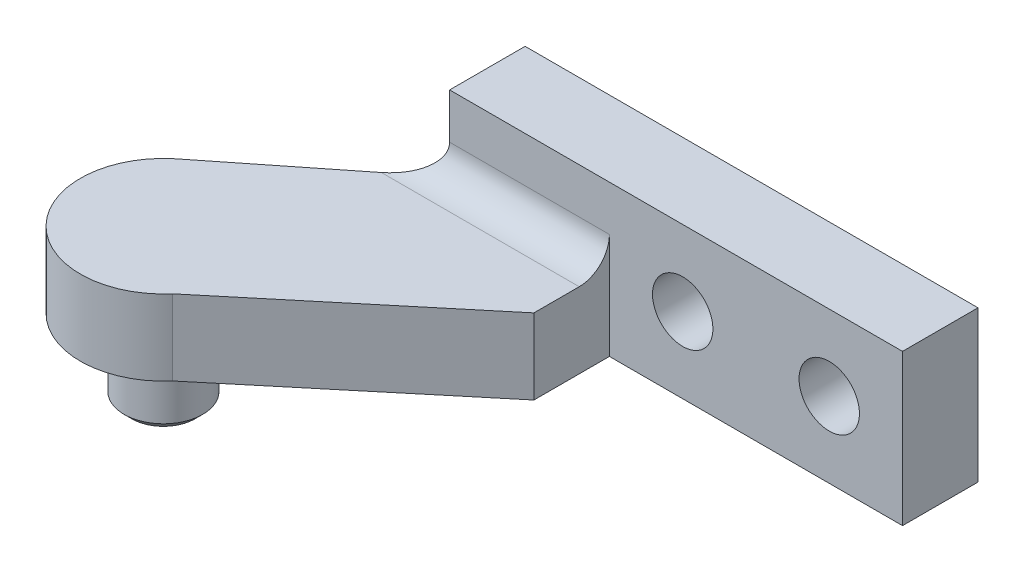
ISO-10303-21;
HEADER;
FILE_DESCRIPTION(('STEP AP214'),'2;1');
FILE_NAME('part.step','',(''),(''),'','','');
FILE_SCHEMA(('AUTOMOTIVE_DESIGN { 1 0 10303 214 1 1 1 1 }'));
ENDSEC;
DATA;
#1=APPLICATION_CONTEXT('core data for automotive mechanical design processes');
#2=APPLICATION_PROTOCOL_DEFINITION('international standard','automotive_design',2000,#1);
#3=PRODUCT_CONTEXT('',#1,'mechanical');
#4=PRODUCT('Part','Part','',(#3));
#5=PRODUCT_RELATED_PRODUCT_CATEGORY('part','',(#4));
#6=PRODUCT_DEFINITION_FORMATION('','',#4);
#7=PRODUCT_DEFINITION_CONTEXT('part definition',#1,'design');
#8=PRODUCT_DEFINITION('design','',#6,#7);
#9=PRODUCT_DEFINITION_SHAPE('','',#8);
#10=(LENGTH_UNIT() NAMED_UNIT(*) SI_UNIT(.MILLI.,.METRE.));
#11=(NAMED_UNIT(*) PLANE_ANGLE_UNIT() SI_UNIT($,.RADIAN.));
#12=(NAMED_UNIT(*) SI_UNIT($,.STERADIAN.) SOLID_ANGLE_UNIT());
#13=UNCERTAINTY_MEASURE_WITH_UNIT(LENGTH_MEASURE(1.E-05),#10,'distance_accuracy_value','');
#14=(GEOMETRIC_REPRESENTATION_CONTEXT(3) GLOBAL_UNCERTAINTY_ASSIGNED_CONTEXT((#13)) GLOBAL_UNIT_ASSIGNED_CONTEXT((#10,
#11,#12)) REPRESENTATION_CONTEXT('',''));
#15=CARTESIAN_POINT('',(0.,0.,0.));
#16=DIRECTION('',(0.,0.,1.));
#17=DIRECTION('',(1.,0.,0.));
#18=AXIS2_PLACEMENT_3D('',#15,#16,#17);
#19=CARTESIAN_POINT('',(21.8540407080777,5.,0.));
#20=DIRECTION('',(-1.,0.,0.));
#21=DIRECTION('',(0.,0.,-1.));
#22=AXIS2_PLACEMENT_3D('',#19,#20,#21);
#23=PLANE('',#22);
#24=DIRECTION('',(0.,-1.,0.));
#25=VECTOR('',#24,1.);
#26=CARTESIAN_POINT('',(21.8540407080777,10.,-19.9532567430728));
#27=LINE('',#26,#25);
#28=CARTESIAN_POINT('',(21.8540407080777,10.,-19.9532567430728));
#29=VERTEX_POINT('',#28);
#30=CARTESIAN_POINT('',(21.8540407080777,0.,-19.9532567430728));
#31=VERTEX_POINT('',#30);
#32=EDGE_CURVE('E116',#29,#31,#27,.T.);
#33=ORIENTED_EDGE('',*,*,#32,.T.);
#34=DIRECTION('',(0.,0.,1.));
#35=VECTOR('',#34,1.);
#36=CARTESIAN_POINT('',(21.8540407080777,0.,0.));
#37=LINE('',#36,#35);
#38=CARTESIAN_POINT('',(21.8540407080777,0.,-24.9532567430728));
#39=VERTEX_POINT('',#38);
#40=EDGE_CURVE('E123',#39,#31,#37,.T.);
#41=ORIENTED_EDGE('',*,*,#40,.F.);
#42=DIRECTION('',(0.,1.,0.));
#43=VECTOR('',#42,1.);
#44=CARTESIAN_POINT('',(21.8540407080777,0.,-24.9532567430728));
#45=LINE('',#44,#43);
#46=CARTESIAN_POINT('',(21.8540407080777,10.,-24.9532567430728));
#47=VERTEX_POINT('',#46);
#48=EDGE_CURVE('E165',#39,#47,#45,.T.);
#49=ORIENTED_EDGE('',*,*,#48,.T.);
#50=DIRECTION('',(0.,0.,1.));
#51=VECTOR('',#50,1.);
#52=CARTESIAN_POINT('',(21.8540407080777,10.,-14.9532567430728));
#53=LINE('',#52,#51);
#54=EDGE_CURVE('E136',#47,#29,#53,.T.);
#55=ORIENTED_EDGE('',*,*,#54,.T.);
#56=EDGE_LOOP('',(#33,#41,#49,#55));
#57=FACE_BOUND('',#56,.T.);
#58=ADVANCED_FACE('F43',(#57),#23,.F.);
#59=CARTESIAN_POINT('',(0.,10.,0.));
#60=DIRECTION('',(0.,-1.,0.));
#61=DIRECTION('',(0.,0.,1.));
#62=AXIS2_PLACEMENT_3D('',#59,#60,#61);
#63=PLANE('',#62);
#64=DIRECTION('',(1.,0.,0.));
#65=VECTOR('',#64,1.);
#66=CARTESIAN_POINT('',(-14.452391165853,10.,-19.9532567430728));
#67=LINE('',#66,#65);
#68=CARTESIAN_POINT('',(-8.14595929192235,10.,-19.9532567430728));
#69=VERTEX_POINT('',#68);
#70=EDGE_CURVE('E140',#69,#29,#67,.T.);
#71=ORIENTED_EDGE('',*,*,#70,.T.);
#72=ORIENTED_EDGE('',*,*,#54,.F.);
#73=DIRECTION('',(1.,0.,0.));
#74=VECTOR('',#73,1.);
#75=CARTESIAN_POINT('',(0.,10.,-24.9532567430728));
#76=LINE('',#75,#74);
#77=CARTESIAN_POINT('',(-8.14595929192235,10.,-24.9532567430728));
#78=VERTEX_POINT('',#77);
#79=EDGE_CURVE('E159',#78,#47,#76,.T.);
#80=ORIENTED_EDGE('',*,*,#79,.F.);
#81=DIRECTION('',(0.,0.,-1.));
#82=VECTOR('',#81,1.);
#83=CARTESIAN_POINT('',(-8.14595929192235,10.,0.));
#84=LINE('',#83,#82);
#85=EDGE_CURVE('E154',#69,#78,#84,.T.);
#86=ORIENTED_EDGE('',*,*,#85,.F.);
#87=EDGE_LOOP('',(#71,#72,#80,#86));
#88=FACE_BOUND('',#87,.T.);
#89=ADVANCED_FACE('F245',(#88),#63,.F.);
#90=CARTESIAN_POINT('',(16.9998841256251,5.,-24.9532567430728));
#91=DIRECTION('',(0.,0.,1.));
#92=DIRECTION('',(-1.,0.,0.));
#93=AXIS2_PLACEMENT_3D('',#90,#91,#92);
#94=CYLINDRICAL_SURFACE('',#93,2.);
#95=CARTESIAN_POINT('',(16.9998841256251,5.,-24.9532567430728));
#96=DIRECTION('',(0.,0.,1.));
#97=DIRECTION('',(1.,0.,0.));
#98=AXIS2_PLACEMENT_3D('',#95,#96,#97);
#99=CIRCLE('',#98,2.);
#100=CARTESIAN_POINT('',(18.9998841256251,5.,-24.9532567430728));
#101=VERTEX_POINT('',#100);
#102=EDGE_CURVE('E150',#101,#101,#99,.T.);
#103=ORIENTED_EDGE('',*,*,#102,.F.);
#104=EDGE_LOOP('',(#103));
#105=FACE_BOUND('',#104,.T.);
#106=CARTESIAN_POINT('',(16.9998841256251,5.,-19.9532567430728));
#107=DIRECTION('',(0.,0.,-1.));
#108=DIRECTION('',(-1.,0.,0.));
#109=AXIS2_PLACEMENT_3D('',#106,#107,#108);
#110=CIRCLE('',#109,2.);
#111=CARTESIAN_POINT('',(14.9998841256251,5.,-19.9532567430728));
#112=VERTEX_POINT('',#111);
#113=EDGE_CURVE('E147',#112,#112,#110,.T.);
#114=ORIENTED_EDGE('',*,*,#113,.F.);
#115=EDGE_LOOP('',(#114));
#116=FACE_BOUND('',#115,.T.);
#117=ADVANCED_FACE('F250',(#105,#116),#94,.F.);
#118=CARTESIAN_POINT('',(7.29157096072009,5.,-24.9532567430728));
#119=DIRECTION('',(0.,0.,1.));
#120=DIRECTION('',(-1.,0.,0.));
#121=AXIS2_PLACEMENT_3D('',#118,#119,#120);
#122=CYLINDRICAL_SURFACE('',#121,2.);
#123=CARTESIAN_POINT('',(7.29157096072009,5.,-24.9532567430728));
#124=DIRECTION('',(0.,0.,-1.));
#125=DIRECTION('',(-1.,0.,0.));
#126=AXIS2_PLACEMENT_3D('',#123,#124,#125);
#127=CIRCLE('',#126,2.);
#128=CARTESIAN_POINT('',(5.29157096072009,5.,-24.9532567430728));
#129=VERTEX_POINT('',#128);
#130=EDGE_CURVE('E151',#129,#129,#127,.T.);
#131=ORIENTED_EDGE('',*,*,#130,.T.);
#132=EDGE_LOOP('',(#131));
#133=FACE_BOUND('',#132,.T.);
#134=CARTESIAN_POINT('',(7.29157096072009,5.,-19.9532567430728));
#135=DIRECTION('',(0.,0.,-1.));
#136=DIRECTION('',(-1.,0.,0.));
#137=AXIS2_PLACEMENT_3D('',#134,#135,#136);
#138=CIRCLE('',#137,2.);
#139=CARTESIAN_POINT('',(5.29157096072009,5.,-19.9532567430728));
#140=VERTEX_POINT('',#139);
#141=EDGE_CURVE('E145',#140,#140,#138,.F.);
#142=ORIENTED_EDGE('',*,*,#141,.T.);
#143=EDGE_LOOP('',(#142));
#144=FACE_BOUND('',#143,.T.);
#145=ADVANCED_FACE('F275',(#133,#144),#122,.F.);
#146=CARTESIAN_POINT('',(0.,0.,-24.9532567430728));
#147=DIRECTION('',(0.,0.,-1.));
#148=DIRECTION('',(1.,0.,0.));
#149=AXIS2_PLACEMENT_3D('',#146,#147,#148);
#150=PLANE('',#149);
#151=ORIENTED_EDGE('',*,*,#102,.T.);
#152=EDGE_LOOP('',(#151));
#153=FACE_BOUND('',#152,.T.);
#154=ORIENTED_EDGE('',*,*,#79,.T.);
#155=ORIENTED_EDGE('',*,*,#48,.F.);
#156=DIRECTION('',(1.,0.,0.));
#157=VECTOR('',#156,1.);
#158=CARTESIAN_POINT('',(0.,0.,-24.9532567430728));
#159=LINE('',#158,#157);
#160=CARTESIAN_POINT('',(-8.14595929192235,0.,-24.9532567430728));
#161=VERTEX_POINT('',#160);
#162=EDGE_CURVE('E127',#161,#39,#159,.T.);
#163=ORIENTED_EDGE('',*,*,#162,.F.);
#164=DIRECTION('',(0.,1.,0.));
#165=VECTOR('',#164,1.);
#166=CARTESIAN_POINT('',(-8.14595929192235,0.,-24.9532567430728));
#167=LINE('',#166,#165);
#168=EDGE_CURVE('E161',#161,#78,#167,.T.);
#169=ORIENTED_EDGE('',*,*,#168,.T.);
#170=EDGE_LOOP('',(#154,#155,#163,#169));
#171=FACE_BOUND('',#170,.T.);
#172=ORIENTED_EDGE('',*,*,#130,.F.);
#173=EDGE_LOOP('',(#172));
#174=FACE_BOUND('',#173,.T.);
#175=ADVANCED_FACE('F242',(#153,#171,#174),#150,.T.);
#176=CARTESIAN_POINT('',(-6.35496567806132,5.,-7.63378536190709));
#177=DIRECTION('',(-0.639796801410756,0.,-0.768544112530026));
#178=DIRECTION('',(0.768544112530026,0.,-0.639796801410756));
#179=AXIS2_PLACEMENT_3D('',#176,#177,#178);
#180=PLANE('',#179);
#181=DIRECTION('',(-0.768544112530026,0.,0.639796801410756));
#182=VECTOR('',#181,1.);
#183=CARTESIAN_POINT('',(-6.35496567806132,0.,-7.63378536190709));
#184=LINE('',#183,#182);
#185=CARTESIAN_POINT('',(2.43741437826756,0.,-14.9532567430728));
#186=VERTEX_POINT('',#185);
#187=CARTESIAN_POINT('',(-10.632140567897,0.,-4.07312726957885));
#188=VERTEX_POINT('',#187);
#189=EDGE_CURVE('E169',#186,#188,#184,.T.);
#190=ORIENTED_EDGE('',*,*,#189,.F.);
#191=DIRECTION('',(0.,-1.,0.));
#192=VECTOR('',#191,1.);
#193=CARTESIAN_POINT('',(2.43741437826756,5.,-14.9532567430728));
#194=LINE('',#193,#192);
#195=CARTESIAN_POINT('',(2.43741437826756,5.,-14.9532567430728));
#196=VERTEX_POINT('',#195);
#197=EDGE_CURVE('E178',#196,#186,#194,.T.);
#198=ORIENTED_EDGE('',*,*,#197,.F.);
#199=DIRECTION('',(-0.768544112530026,0.,0.639796801410756));
#200=VECTOR('',#199,1.);
#201=CARTESIAN_POINT('',(-6.35496567806132,5.,-7.63378536190709));
#202=LINE('',#201,#200);
#203=CARTESIAN_POINT('',(-10.632140567897,5.,-4.07312726957885));
#204=VERTEX_POINT('',#203);
#205=EDGE_CURVE('E131',#196,#204,#202,.T.);
#206=ORIENTED_EDGE('',*,*,#205,.T.);
#207=DIRECTION('',(0.,-1.,0.));
#208=VECTOR('',#207,1.);
#209=CARTESIAN_POINT('',(-10.632140567897,5.,-4.07312726957885));
#210=LINE('',#209,#208);
#211=EDGE_CURVE('E194',#204,#188,#210,.T.);
#212=ORIENTED_EDGE('',*,*,#211,.T.);
#213=EDGE_LOOP('',(#190,#198,#206,#212));
#214=FACE_BOUND('',#213,.T.);
#215=ADVANCED_FACE('F232',(#214),#180,.F.);
#216=CARTESIAN_POINT('',(-14.807385824528,5.,-7.65325674307282));
#217=DIRECTION('',(0.,-1.,0.));
#218=DIRECTION('',(0.,0.,1.));
#219=AXIS2_PLACEMENT_3D('',#216,#217,#218);
#220=CYLINDRICAL_SURFACE('',#219,5.5);
#221=CARTESIAN_POINT('',(-14.807385824528,0.,-7.65325674307282));
#222=DIRECTION('',(0.,-1.,0.));
#223=DIRECTION('',(0.,0.,-1.));
#224=AXIS2_PLACEMENT_3D('',#221,#222,#223);
#225=CIRCLE('',#224,5.5);
#226=CARTESIAN_POINT('',(-18.2679945911423,0.,-11.9280885484697));
#227=VERTEX_POINT('',#226);
#228=EDGE_CURVE('E180',#188,#227,#225,.T.);
#229=ORIENTED_EDGE('',*,*,#228,.F.);
#230=ORIENTED_EDGE('',*,*,#211,.F.);
#231=CARTESIAN_POINT('',(-14.807385824528,5.,-7.65325674307282));
#232=DIRECTION('',(0.,-1.,0.));
#233=DIRECTION('',(0.,0.,-1.));
#234=AXIS2_PLACEMENT_3D('',#231,#232,#233);
#235=CIRCLE('',#234,5.5);
#236=CARTESIAN_POINT('',(-18.2679945911423,5.,-11.9280885484697));
#237=VERTEX_POINT('',#236);
#238=EDGE_CURVE('E172',#204,#237,#235,.T.);
#239=ORIENTED_EDGE('',*,*,#238,.T.);
#240=DIRECTION('',(0.,-1.,0.));
#241=VECTOR('',#240,1.);
#242=CARTESIAN_POINT('',(-18.2679945911423,5.,-11.9280885484697));
#243=LINE('',#242,#241);
#244=EDGE_CURVE('E191',#237,#227,#243,.T.);
#245=ORIENTED_EDGE('',*,*,#244,.T.);
#246=EDGE_LOOP('',(#229,#230,#239,#245));
#247=FACE_BOUND('',#246,.T.);
#248=ADVANCED_FACE('F234',(#247),#220,.T.);
#249=CARTESIAN_POINT('',(-12.8578713762529,5.,-16.2174579756204));
#250=DIRECTION('',(0.621268629874655,0.,0.783597657942945));
#251=DIRECTION('',(-0.783597657942945,0.,0.621268629874655));
#252=AXIS2_PLACEMENT_3D('',#249,#250,#251);
#253=PLANE('',#252);
#254=DIRECTION('',(0.,-1.,0.));
#255=VECTOR('',#254,1.);
#256=CARTESIAN_POINT('',(-8.14595929192235,5.,-19.9532567430728));
#257=LINE('',#256,#255);
#258=CARTESIAN_POINT('',(-8.14595929192235,7.,-19.9532567430728));
#259=VERTEX_POINT('',#258);
#260=CARTESIAN_POINT('',(-8.14595929192235,0.,-19.9532567430728));
#261=VERTEX_POINT('',#260);
#262=EDGE_CURVE('E187',#259,#261,#257,.T.);
#263=ORIENTED_EDGE('',*,*,#262,.T.);
#264=DIRECTION('',(0.783597657942946,0.,-0.621268629874655));
#265=VECTOR('',#264,1.);
#266=CARTESIAN_POINT('',(-12.8578713762529,0.,-16.2174579756204));
#267=LINE('',#266,#265);
#268=EDGE_CURVE('E132',#227,#261,#267,.T.);
#269=ORIENTED_EDGE('',*,*,#268,.F.);
#270=ORIENTED_EDGE('',*,*,#244,.F.);
#271=DIRECTION('',(0.783597657942946,0.,-0.621268629874655));
#272=VECTOR('',#271,1.);
#273=CARTESIAN_POINT('',(-12.8578713762529,5.,-16.2174579756204));
#274=LINE('',#273,#272);
#275=CARTESIAN_POINT('',(-10.6685320414946,5.,-17.9532567430728));
#276=VERTEX_POINT('',#275);
#277=EDGE_CURVE('E175',#237,#276,#274,.T.);
#278=ORIENTED_EDGE('',*,*,#277,.T.);
#279=CARTESIAN_POINT('',(-10.6685320414946,7.,-17.9532567430728));
#280=DIRECTION('',(-0.621268629874655,0.,-0.783597657942945));
#281=DIRECTION('',(0.783597657942945,0.,-0.621268629874655));
#282=AXIS2_PLACEMENT_3D('',#279,#280,#281);
#283=ELLIPSE('',#282,3.21921935830482,2.);
#284=EDGE_CURVE('E52',#259,#276,#283,.T.);
#285=ORIENTED_EDGE('',*,*,#284,.F.);
#286=EDGE_LOOP('',(#263,#269,#270,#278,#285));
#287=FACE_BOUND('',#286,.T.);
#288=ADVANCED_FACE('F223',(#287),#253,.F.);
#289=CARTESIAN_POINT('',(0.,5.,0.));
#290=DIRECTION('',(0.,1.,0.));
#291=DIRECTION('',(0.,0.,-1.));
#292=AXIS2_PLACEMENT_3D('',#289,#290,#291);
#293=PLANE('',#292);
#294=ORIENTED_EDGE('',*,*,#277,.F.);
#295=ORIENTED_EDGE('',*,*,#238,.F.);
#296=ORIENTED_EDGE('',*,*,#205,.F.);
#297=DIRECTION('',(0.,0.,1.));
#298=VECTOR('',#297,1.);
#299=CARTESIAN_POINT('',(2.43741437826756,5.,-19.9532567430728));
#300=LINE('',#299,#298);
#301=CARTESIAN_POINT('',(2.43741437826756,5.,-17.9532567430728));
#302=VERTEX_POINT('',#301);
#303=EDGE_CURVE('E143',#302,#196,#300,.T.);
#304=ORIENTED_EDGE('',*,*,#303,.F.);
#305=DIRECTION('',(-1.,0.,0.));
#306=VECTOR('',#305,1.);
#307=CARTESIAN_POINT('',(2.43741437826756,5.,-17.9532567430728));
#308=LINE('',#307,#306);
#309=EDGE_CURVE('E214',#276,#302,#308,.F.);
#310=ORIENTED_EDGE('',*,*,#309,.F.);
#311=EDGE_LOOP('',(#294,#295,#296,#304,#310));
#312=FACE_BOUND('',#311,.T.);
#313=ADVANCED_FACE('F225',(#312),#293,.T.);
#314=CARTESIAN_POINT('',(0.,0.,0.));
#315=DIRECTION('',(0.,1.,0.));
#316=DIRECTION('',(0.,0.,-1.));
#317=AXIS2_PLACEMENT_3D('',#314,#315,#316);
#318=PLANE('',#317);
#319=CARTESIAN_POINT('',(-14.807385824528,0.,-7.65325674307282));
#320=DIRECTION('',(0.,-1.,0.));
#321=DIRECTION('',(0.,0.,-1.));
#322=AXIS2_PLACEMENT_3D('',#319,#320,#321);
#323=CIRCLE('',#322,3.6);
#324=CARTESIAN_POINT('',(-14.807385824528,0.,-11.2532567430728));
#325=VERTEX_POINT('',#324);
#326=EDGE_CURVE('E203',#325,#325,#323,.T.);
#327=ORIENTED_EDGE('',*,*,#326,.F.);
#328=EDGE_LOOP('',(#327));
#329=FACE_BOUND('',#328,.T.);
#330=ORIENTED_EDGE('',*,*,#189,.T.);
#331=ORIENTED_EDGE('',*,*,#228,.T.);
#332=ORIENTED_EDGE('',*,*,#268,.T.);
#333=DIRECTION('',(0.,0.,-1.));
#334=VECTOR('',#333,1.);
#335=CARTESIAN_POINT('',(-8.14595929192235,0.,0.));
#336=LINE('',#335,#334);
#337=EDGE_CURVE('E157',#261,#161,#336,.T.);
#338=ORIENTED_EDGE('',*,*,#337,.T.);
#339=ORIENTED_EDGE('',*,*,#162,.T.);
#340=ORIENTED_EDGE('',*,*,#40,.T.);
#341=DIRECTION('',(-1.,0.,0.));
#342=VECTOR('',#341,1.);
#343=CARTESIAN_POINT('',(21.8540407080777,0.,-19.9532567430728));
#344=LINE('',#343,#342);
#345=CARTESIAN_POINT('',(2.43741437826756,0.,-19.9532567430728));
#346=VERTEX_POINT('',#345);
#347=EDGE_CURVE('E110',#31,#346,#344,.T.);
#348=ORIENTED_EDGE('',*,*,#347,.T.);
#349=DIRECTION('',(0.,0.,1.));
#350=VECTOR('',#349,1.);
#351=CARTESIAN_POINT('',(2.43741437826756,0.,-19.9532567430728));
#352=LINE('',#351,#350);
#353=EDGE_CURVE('E142',#346,#186,#352,.T.);
#354=ORIENTED_EDGE('',*,*,#353,.T.);
#355=EDGE_LOOP('',(#330,#331,#332,#338,#339,#340,#348,#354));
#356=FACE_BOUND('',#355,.T.);
#357=ADVANCED_FACE('F125',(#329,#356),#318,.F.);
#358=CARTESIAN_POINT('',(-14.807385824528,-5.,-7.65325674307282));
#359=DIRECTION('',(0.,1.,0.));
#360=DIRECTION('',(0.,0.,-1.));
#361=AXIS2_PLACEMENT_3D('',#358,#359,#360);
#362=CYLINDRICAL_SURFACE('',#361,2.6);
#363=CARTESIAN_POINT('',(-14.807385824528,-1.,-7.65325674307282));
#364=DIRECTION('',(0.,-1.,0.));
#365=DIRECTION('',(0.,0.,-1.));
#366=AXIS2_PLACEMENT_3D('',#363,#364,#365);
#367=CIRCLE('',#366,2.6);
#368=CARTESIAN_POINT('',(-14.807385824528,-1.,-10.2532567430728));
#369=VERTEX_POINT('',#368);
#370=EDGE_CURVE('E206',#369,#369,#367,.F.);
#371=ORIENTED_EDGE('',*,*,#370,.F.);
#372=EDGE_LOOP('',(#371));
#373=FACE_BOUND('',#372,.T.);
#374=CARTESIAN_POINT('',(-14.807385824528,-4.5,-7.65325674307282));
#375=DIRECTION('',(0.,-1.,0.));
#376=DIRECTION('',(0.,0.,-1.));
#377=AXIS2_PLACEMENT_3D('',#374,#375,#376);
#378=CIRCLE('',#377,2.6);
#379=CARTESIAN_POINT('',(-14.807385824528,-4.5,-10.2532567430728));
#380=VERTEX_POINT('',#379);
#381=EDGE_CURVE('E197',#380,#380,#378,.T.);
#382=ORIENTED_EDGE('',*,*,#381,.F.);
#383=EDGE_LOOP('',(#382));
#384=FACE_BOUND('',#383,.T.);
#385=ADVANCED_FACE('F256',(#373,#384),#362,.T.);
#386=CARTESIAN_POINT('',(0.,-5.,0.));
#387=DIRECTION('',(0.,1.,0.));
#388=DIRECTION('',(0.,0.,-1.));
#389=AXIS2_PLACEMENT_3D('',#386,#387,#388);
#390=PLANE('',#389);
#391=CARTESIAN_POINT('',(-14.807385824528,-5.,-7.65325674307282));
#392=DIRECTION('',(0.,-1.,0.));
#393=DIRECTION('',(0.,0.,-1.));
#394=AXIS2_PLACEMENT_3D('',#391,#392,#393);
#395=CIRCLE('',#394,2.09999999999999);
#396=CARTESIAN_POINT('',(-14.807385824528,-5.,-9.75325674307281));
#397=VERTEX_POINT('',#396);
#398=EDGE_CURVE('E200',#397,#397,#395,.F.);
#399=ORIENTED_EDGE('',*,*,#398,.F.);
#400=EDGE_LOOP('',(#399));
#401=FACE_BOUND('',#400,.T.);
#402=ADVANCED_FACE('F262',(#401),#390,.F.);
#403=CARTESIAN_POINT('',(-14.807385824528,-4.5,-7.65325674307282));
#404=DIRECTION('',(0.,1.,0.));
#405=DIRECTION('',(0.,0.,-1.));
#406=AXIS2_PLACEMENT_3D('',#403,#404,#405);
#407=CONICAL_SURFACE('',#406,2.6,0.785398163397451);
#408=ORIENTED_EDGE('',*,*,#398,.T.);
#409=EDGE_LOOP('',(#408));
#410=FACE_BOUND('',#409,.T.);
#411=ORIENTED_EDGE('',*,*,#381,.T.);
#412=EDGE_LOOP('',(#411));
#413=FACE_BOUND('',#412,.T.);
#414=ADVANCED_FACE('F265',(#410,#413),#407,.T.);
#415=CARTESIAN_POINT('',(-14.807385824528,-1.,-7.65325674307282));
#416=DIRECTION('',(0.,1.,0.));
#417=DIRECTION('',(0.,0.,-1.));
#418=AXIS2_PLACEMENT_3D('',#415,#416,#417);
#419=TOROIDAL_SURFACE('',#418,3.6,1.);
#420=ORIENTED_EDGE('',*,*,#370,.T.);
#421=EDGE_LOOP('',(#420));
#422=FACE_BOUND('',#421,.T.);
#423=ORIENTED_EDGE('',*,*,#326,.T.);
#424=EDGE_LOOP('',(#423));
#425=FACE_BOUND('',#424,.T.);
#426=ADVANCED_FACE('F271',(#422,#425),#419,.F.);
#427=CARTESIAN_POINT('',(-8.14595929192235,0.,0.));
#428=DIRECTION('',(-1.,0.,0.));
#429=DIRECTION('',(0.,0.,-1.));
#430=AXIS2_PLACEMENT_3D('',#427,#428,#429);
#431=PLANE('',#430);
#432=ORIENTED_EDGE('',*,*,#85,.T.);
#433=ORIENTED_EDGE('',*,*,#168,.F.);
#434=ORIENTED_EDGE('',*,*,#337,.F.);
#435=ORIENTED_EDGE('',*,*,#262,.F.);
#436=EDGE_CURVE('E188',#69,#259,#257,.T.);
#437=ORIENTED_EDGE('',*,*,#436,.F.);
#438=EDGE_LOOP('',(#432,#433,#434,#435,#437));
#439=FACE_BOUND('',#438,.T.);
#440=ADVANCED_FACE('F268',(#439),#431,.T.);
#441=CARTESIAN_POINT('',(0.,0.,-19.9532567430728));
#442=DIRECTION('',(0.,0.,1.));
#443=DIRECTION('',(-1.,0.,0.));
#444=AXIS2_PLACEMENT_3D('',#441,#442,#443);
#445=PLANE('',#444);
#446=ORIENTED_EDGE('',*,*,#113,.T.);
#447=EDGE_LOOP('',(#446));
#448=FACE_BOUND('',#447,.T.);
#449=DIRECTION('',(0.,1.,0.));
#450=VECTOR('',#449,1.);
#451=CARTESIAN_POINT('',(2.43741437826756,0.,-19.9532567430728));
#452=LINE('',#451,#450);
#453=CARTESIAN_POINT('',(2.43741437826756,7.,-19.9532567430728));
#454=VERTEX_POINT('',#453);
#455=EDGE_CURVE('E118',#346,#454,#452,.T.);
#456=ORIENTED_EDGE('',*,*,#455,.F.);
#457=ORIENTED_EDGE('',*,*,#347,.F.);
#458=ORIENTED_EDGE('',*,*,#32,.F.);
#459=ORIENTED_EDGE('',*,*,#70,.F.);
#460=ORIENTED_EDGE('',*,*,#436,.T.);
#461=DIRECTION('',(-1.,0.,0.));
#462=VECTOR('',#461,1.);
#463=CARTESIAN_POINT('',(-8.14595929192235,7.,-19.9532567430728));
#464=LINE('',#463,#462);
#465=EDGE_CURVE('E209',#454,#259,#464,.T.);
#466=ORIENTED_EDGE('',*,*,#465,.F.);
#467=EDGE_LOOP('',(#456,#457,#458,#459,#460,#466));
#468=FACE_BOUND('',#467,.T.);
#469=ORIENTED_EDGE('',*,*,#141,.F.);
#470=EDGE_LOOP('',(#469));
#471=FACE_BOUND('',#470,.T.);
#472=ADVANCED_FACE('F112',(#448,#468,#471),#445,.T.);
#473=CARTESIAN_POINT('',(2.43741437826756,0.,-19.9532567430728));
#474=DIRECTION('',(-1.,0.,0.));
#475=DIRECTION('',(0.,0.,-1.));
#476=AXIS2_PLACEMENT_3D('',#473,#474,#475);
#477=PLANE('',#476);
#478=ORIENTED_EDGE('',*,*,#197,.T.);
#479=ORIENTED_EDGE('',*,*,#353,.F.);
#480=ORIENTED_EDGE('',*,*,#455,.T.);
#481=CARTESIAN_POINT('',(2.43741437826756,7.,-17.9532567430728));
#482=DIRECTION('',(1.,0.,0.));
#483=DIRECTION('',(0.,0.,-1.));
#484=AXIS2_PLACEMENT_3D('',#481,#482,#483);
#485=CIRCLE('',#484,2.);
#486=EDGE_CURVE('E11',#302,#454,#485,.T.);
#487=ORIENTED_EDGE('',*,*,#486,.F.);
#488=ORIENTED_EDGE('',*,*,#303,.T.);
#489=EDGE_LOOP('',(#478,#479,#480,#487,#488));
#490=FACE_BOUND('',#489,.T.);
#491=ADVANCED_FACE('F229',(#490),#477,.F.);
#492=CARTESIAN_POINT('',(0.,7.,-17.9532567430728));
#493=DIRECTION('',(1.,0.,0.));
#494=DIRECTION('',(0.,0.,1.));
#495=AXIS2_PLACEMENT_3D('',#492,#493,#494);
#496=CYLINDRICAL_SURFACE('',#495,2.);
#497=ORIENTED_EDGE('',*,*,#486,.T.);
#498=ORIENTED_EDGE('',*,*,#465,.T.);
#499=ORIENTED_EDGE('',*,*,#284,.T.);
#500=ORIENTED_EDGE('',*,*,#309,.T.);
#501=EDGE_LOOP('',(#497,#498,#499,#500));
#502=FACE_BOUND('',#501,.T.);
#503=ADVANCED_FACE('F45',(#502),#496,.F.);
#504=CLOSED_SHELL('',(#58,#89,#117,#145,#175,#215,#248,#288,#313,#357,#385,#402,#414,#426,#440,
#472,#491,#503));
#505=MANIFOLD_SOLID_BREP('B2',#504);
#506=ADVANCED_BREP_SHAPE_REPRESENTATION('',(#18,#505),#14);
#507=SHAPE_DEFINITION_REPRESENTATION(#9,#506);
ENDSEC;
END-ISO-10303-21;
